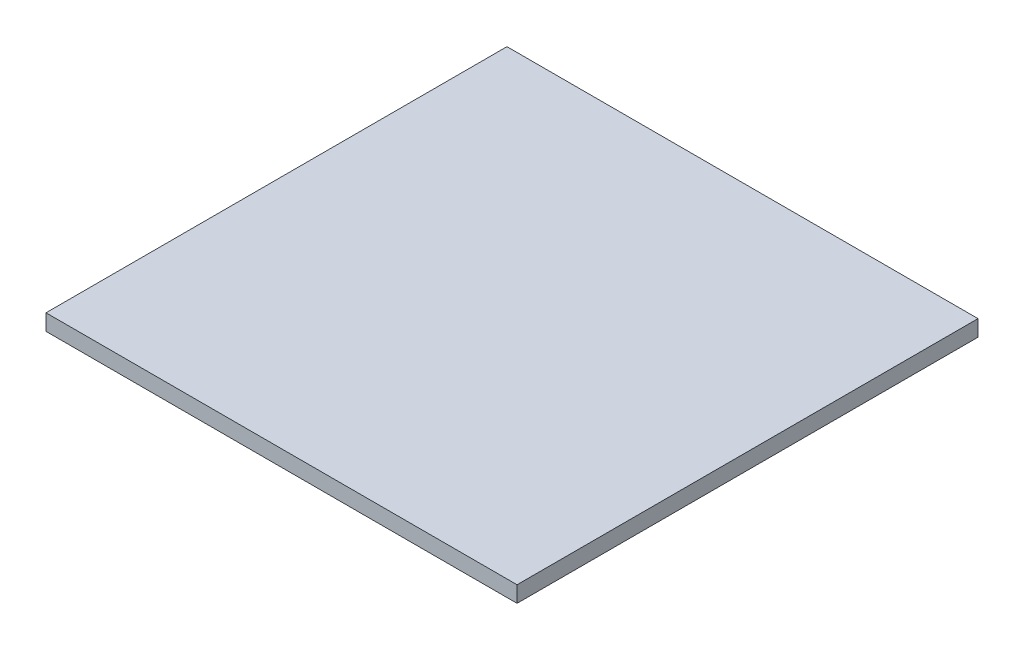
ISO-10303-21;
HEADER;
FILE_DESCRIPTION(('STEP AP214'),'2;1');
FILE_NAME('part.step','',(''),(''),'','','');
FILE_SCHEMA(('AUTOMOTIVE_DESIGN { 1 0 10303 214 1 1 1 1 }'));
ENDSEC;
DATA;
#1=APPLICATION_CONTEXT('core data for automotive mechanical design processes');
#2=APPLICATION_PROTOCOL_DEFINITION('international standard','automotive_design',2000,#1);
#3=PRODUCT_CONTEXT('',#1,'mechanical');
#4=PRODUCT('Part','Part','',(#3));
#5=PRODUCT_RELATED_PRODUCT_CATEGORY('part','',(#4));
#6=PRODUCT_DEFINITION_FORMATION('','',#4);
#7=PRODUCT_DEFINITION_CONTEXT('part definition',#1,'design');
#8=PRODUCT_DEFINITION('design','',#6,#7);
#9=PRODUCT_DEFINITION_SHAPE('','',#8);
#10=(LENGTH_UNIT() NAMED_UNIT(*) SI_UNIT(.MILLI.,.METRE.));
#11=(NAMED_UNIT(*) PLANE_ANGLE_UNIT() SI_UNIT($,.RADIAN.));
#12=(NAMED_UNIT(*) SI_UNIT($,.STERADIAN.) SOLID_ANGLE_UNIT());
#13=UNCERTAINTY_MEASURE_WITH_UNIT(LENGTH_MEASURE(1.E-05),#10,'distance_accuracy_value','');
#14=(GEOMETRIC_REPRESENTATION_CONTEXT(3) GLOBAL_UNCERTAINTY_ASSIGNED_CONTEXT((#13)) GLOBAL_UNIT_ASSIGNED_CONTEXT((#10,
#11,#12)) REPRESENTATION_CONTEXT('',''));
#15=CARTESIAN_POINT('',(0.,0.,0.));
#16=DIRECTION('',(0.,0.,1.));
#17=DIRECTION('',(1.,0.,0.));
#18=AXIS2_PLACEMENT_3D('',#15,#16,#17);
#19=CARTESIAN_POINT('',(73.0346049157236,-17.5999999999992,-71.4699544006247));
#20=DIRECTION('',(-1.,0.,0.));
#21=DIRECTION('',(0.,-1.,0.));
#22=AXIS2_PLACEMENT_3D('',#19,#20,#21);
#23=PLANE('',#22);
#24=DIRECTION('',(0.,0.,1.));
#25=VECTOR('',#24,1.);
#26=CARTESIAN_POINT('',(73.0346049157236,-12.5999999999993,-71.4699544006247));
#27=LINE('',#26,#25);
#28=CARTESIAN_POINT('',(73.0346049157236,-12.5999999999993,-71.4699544006247));
#29=VERTEX_POINT('',#28);
#30=CARTESIAN_POINT('',(73.0346049157236,-12.6000000000007,71.4699544006244));
#31=VERTEX_POINT('',#30);
#32=EDGE_CURVE('E102',#29,#31,#27,.T.);
#33=ORIENTED_EDGE('',*,*,#32,.T.);
#34=DIRECTION('',(0.,1.,0.));
#35=VECTOR('',#34,1.);
#36=CARTESIAN_POINT('',(73.0346049157236,-17.6000000000007,71.4699544006244));
#37=LINE('',#36,#35);
#38=CARTESIAN_POINT('',(73.0346049157236,-17.6000000000007,71.4699544006244));
#39=VERTEX_POINT('',#38);
#40=EDGE_CURVE('E11',#39,#31,#37,.T.);
#41=ORIENTED_EDGE('',*,*,#40,.F.);
#42=DIRECTION('',(0.,0.,1.));
#43=VECTOR('',#42,1.);
#44=CARTESIAN_POINT('',(73.0346049157236,-17.5999999999992,-71.4699544006247));
#45=LINE('',#44,#43);
#46=CARTESIAN_POINT('',(73.0346049157236,-17.5999999999992,-71.4699544006247));
#47=VERTEX_POINT('',#46);
#48=EDGE_CURVE('E90',#47,#39,#45,.T.);
#49=ORIENTED_EDGE('',*,*,#48,.F.);
#50=DIRECTION('',(0.,1.,0.));
#51=VECTOR('',#50,1.);
#52=CARTESIAN_POINT('',(73.0346049157236,-17.5999999999992,-71.4699544006247));
#53=LINE('',#52,#51);
#54=EDGE_CURVE('E98',#47,#29,#53,.T.);
#55=ORIENTED_EDGE('',*,*,#54,.T.);
#56=EDGE_LOOP('',(#33,#41,#49,#55));
#57=FACE_BOUND('',#56,.T.);
#58=ADVANCED_FACE('F39',(#57),#23,.F.);
#59=CARTESIAN_POINT('',(-73.0346049157236,-17.6000000000007,71.4699544006244));
#60=DIRECTION('',(0.,0.,-1.));
#61=DIRECTION('',(0.,1.,0.));
#62=AXIS2_PLACEMENT_3D('',#59,#60,#61);
#63=PLANE('',#62);
#64=DIRECTION('',(-1.,0.,0.));
#65=VECTOR('',#64,1.);
#66=CARTESIAN_POINT('',(-73.0346049157236,-12.6000000000007,71.4699544006244));
#67=LINE('',#66,#65);
#68=CARTESIAN_POINT('',(-73.0346049157236,-12.6000000000007,71.4699544006244));
#69=VERTEX_POINT('',#68);
#70=EDGE_CURVE('E94',#31,#69,#67,.T.);
#71=ORIENTED_EDGE('',*,*,#70,.T.);
#72=DIRECTION('',(0.,1.,0.));
#73=VECTOR('',#72,1.);
#74=CARTESIAN_POINT('',(-73.0346049157236,-17.6000000000007,71.4699544006244));
#75=LINE('',#74,#73);
#76=CARTESIAN_POINT('',(-73.0346049157236,-17.6000000000007,71.4699544006244));
#77=VERTEX_POINT('',#76);
#78=EDGE_CURVE('E47',#77,#69,#75,.T.);
#79=ORIENTED_EDGE('',*,*,#78,.F.);
#80=DIRECTION('',(-1.,0.,0.));
#81=VECTOR('',#80,1.);
#82=CARTESIAN_POINT('',(-73.0346049157236,-17.6000000000007,71.4699544006244));
#83=LINE('',#82,#81);
#84=EDGE_CURVE('E85',#39,#77,#83,.T.);
#85=ORIENTED_EDGE('',*,*,#84,.F.);
#86=ORIENTED_EDGE('',*,*,#40,.T.);
#87=EDGE_LOOP('',(#71,#79,#85,#86));
#88=FACE_BOUND('',#87,.T.);
#89=ADVANCED_FACE('F93',(#88),#63,.F.);
#90=CARTESIAN_POINT('',(-73.0346049157236,-17.5999999999992,-71.4699544006247));
#91=DIRECTION('',(1.,0.,0.));
#92=DIRECTION('',(0.,1.,0.));
#93=AXIS2_PLACEMENT_3D('',#90,#91,#92);
#94=PLANE('',#93);
#95=DIRECTION('',(0.,0.,-1.));
#96=VECTOR('',#95,1.);
#97=CARTESIAN_POINT('',(-73.0346049157236,-12.5999999999993,-71.4699544006247));
#98=LINE('',#97,#96);
#99=CARTESIAN_POINT('',(-73.0346049157236,-12.5999999999993,-71.4699544006247));
#100=VERTEX_POINT('',#99);
#101=EDGE_CURVE('E72',#69,#100,#98,.T.);
#102=ORIENTED_EDGE('',*,*,#101,.T.);
#103=DIRECTION('',(0.,1.,0.));
#104=VECTOR('',#103,1.);
#105=CARTESIAN_POINT('',(-73.0346049157236,-17.5999999999992,-71.4699544006247));
#106=LINE('',#105,#104);
#107=CARTESIAN_POINT('',(-73.0346049157236,-17.5999999999992,-71.4699544006247));
#108=VERTEX_POINT('',#107);
#109=EDGE_CURVE('E95',#108,#100,#106,.T.);
#110=ORIENTED_EDGE('',*,*,#109,.F.);
#111=DIRECTION('',(0.,0.,-1.));
#112=VECTOR('',#111,1.);
#113=CARTESIAN_POINT('',(-73.0346049157236,-17.5999999999992,-71.4699544006247));
#114=LINE('',#113,#112);
#115=EDGE_CURVE('E88',#77,#108,#114,.T.);
#116=ORIENTED_EDGE('',*,*,#115,.F.);
#117=ORIENTED_EDGE('',*,*,#78,.T.);
#118=EDGE_LOOP('',(#102,#110,#116,#117));
#119=FACE_BOUND('',#118,.T.);
#120=ADVANCED_FACE('F96',(#119),#94,.F.);
#121=CARTESIAN_POINT('',(-73.0346049157236,-17.5999999999992,-71.4699544006247));
#122=DIRECTION('',(0.,0.,1.));
#123=DIRECTION('',(0.,-1.,0.));
#124=AXIS2_PLACEMENT_3D('',#121,#122,#123);
#125=PLANE('',#124);
#126=DIRECTION('',(1.,0.,0.));
#127=VECTOR('',#126,1.);
#128=CARTESIAN_POINT('',(-73.0346049157236,-12.5999999999993,-71.4699544006247));
#129=LINE('',#128,#127);
#130=EDGE_CURVE('E78',#100,#29,#129,.T.);
#131=ORIENTED_EDGE('',*,*,#130,.T.);
#132=ORIENTED_EDGE('',*,*,#54,.F.);
#133=DIRECTION('',(1.,0.,0.));
#134=VECTOR('',#133,1.);
#135=CARTESIAN_POINT('',(-73.0346049157236,-17.5999999999992,-71.4699544006247));
#136=LINE('',#135,#134);
#137=EDGE_CURVE('E55',#108,#47,#136,.T.);
#138=ORIENTED_EDGE('',*,*,#137,.F.);
#139=ORIENTED_EDGE('',*,*,#109,.T.);
#140=EDGE_LOOP('',(#131,#132,#138,#139));
#141=FACE_BOUND('',#140,.T.);
#142=ADVANCED_FACE('F109',(#141),#125,.F.);
#143=CARTESIAN_POINT('',(0.,-17.6,-1.84489931694821E-13));
#144=DIRECTION('',(0.,1.,0.));
#145=DIRECTION('',(0.,0.,1.));
#146=AXIS2_PLACEMENT_3D('',#143,#144,#145);
#147=PLANE('',#146);
#148=ORIENTED_EDGE('',*,*,#48,.T.);
#149=ORIENTED_EDGE('',*,*,#84,.T.);
#150=ORIENTED_EDGE('',*,*,#115,.T.);
#151=ORIENTED_EDGE('',*,*,#137,.T.);
#152=EDGE_LOOP('',(#148,#149,#150,#151));
#153=FACE_BOUND('',#152,.T.);
#154=ADVANCED_FACE('F86',(#153),#147,.F.);
#155=CARTESIAN_POINT('',(0.,-12.6,-1.32117711612174E-13));
#156=DIRECTION('',(0.,1.,0.));
#157=DIRECTION('',(0.,0.,1.));
#158=AXIS2_PLACEMENT_3D('',#155,#156,#157);
#159=PLANE('',#158);
#160=ORIENTED_EDGE('',*,*,#32,.F.);
#161=ORIENTED_EDGE('',*,*,#130,.F.);
#162=ORIENTED_EDGE('',*,*,#101,.F.);
#163=ORIENTED_EDGE('',*,*,#70,.F.);
#164=EDGE_LOOP('',(#160,#161,#162,#163));
#165=FACE_BOUND('',#164,.T.);
#166=ADVANCED_FACE('F112',(#165),#159,.T.);
#167=CLOSED_SHELL('',(#58,#89,#120,#142,#154,#166));
#168=MANIFOLD_SOLID_BREP('B2',#167);
#169=ADVANCED_BREP_SHAPE_REPRESENTATION('',(#18,#168),#14);
#170=SHAPE_DEFINITION_REPRESENTATION(#9,#169);
ENDSEC;
END-ISO-10303-21;
